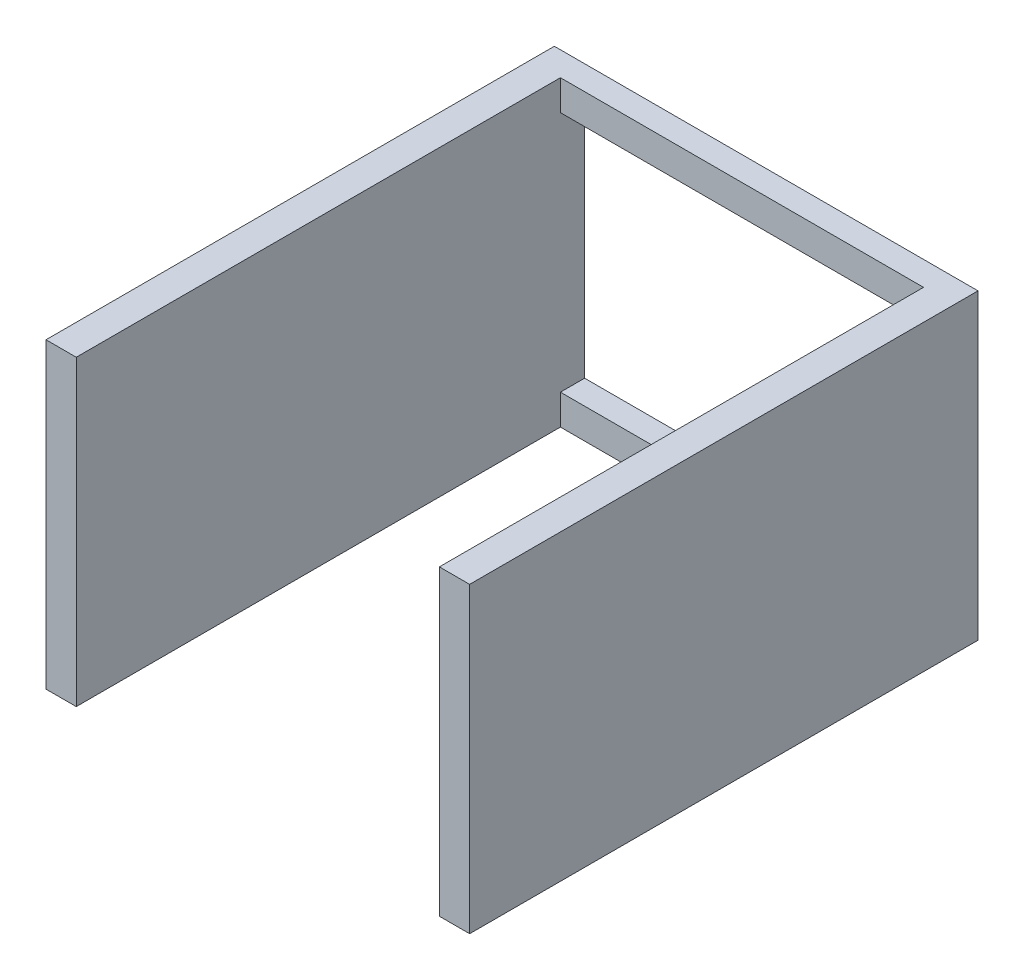
ISO-10303-21;
HEADER;
FILE_DESCRIPTION(('STEP AP214'),'2;1');
FILE_NAME('part.step','',(''),(''),'','','');
FILE_SCHEMA(('AUTOMOTIVE_DESIGN { 1 0 10303 214 1 1 1 1 }'));
ENDSEC;
DATA;
#1=APPLICATION_CONTEXT('core data for automotive mechanical design processes');
#2=APPLICATION_PROTOCOL_DEFINITION('international standard','automotive_design',2000,#1);
#3=PRODUCT_CONTEXT('',#1,'mechanical');
#4=PRODUCT('Part','Part','',(#3));
#5=PRODUCT_RELATED_PRODUCT_CATEGORY('part','',(#4));
#6=PRODUCT_DEFINITION_FORMATION('','',#4);
#7=PRODUCT_DEFINITION_CONTEXT('part definition',#1,'design');
#8=PRODUCT_DEFINITION('design','',#6,#7);
#9=PRODUCT_DEFINITION_SHAPE('','',#8);
#10=(LENGTH_UNIT() NAMED_UNIT(*) SI_UNIT(.MILLI.,.METRE.));
#11=(NAMED_UNIT(*) PLANE_ANGLE_UNIT() SI_UNIT($,.RADIAN.));
#12=(NAMED_UNIT(*) SI_UNIT($,.STERADIAN.) SOLID_ANGLE_UNIT());
#13=UNCERTAINTY_MEASURE_WITH_UNIT(LENGTH_MEASURE(1.E-05),#10,'distance_accuracy_value','');
#14=(GEOMETRIC_REPRESENTATION_CONTEXT(3) GLOBAL_UNCERTAINTY_ASSIGNED_CONTEXT((#13)) GLOBAL_UNIT_ASSIGNED_CONTEXT((#10,
#11,#12)) REPRESENTATION_CONTEXT('',''));
#15=CARTESIAN_POINT('',(0.,0.,0.));
#16=DIRECTION('',(0.,0.,1.));
#17=DIRECTION('',(1.,0.,0.));
#18=AXIS2_PLACEMENT_3D('',#15,#16,#17);
#19=CARTESIAN_POINT('',(0.,0.,42.));
#20=DIRECTION('',(0.,0.,-1.));
#21=DIRECTION('',(-1.,0.,0.));
#22=AXIS2_PLACEMENT_3D('',#19,#20,#21);
#23=PLANE('',#22);
#24=DIRECTION('',(1.,0.,0.));
#25=VECTOR('',#24,1.);
#26=CARTESIAN_POINT('',(0.,0.,42.));
#27=LINE('',#26,#25);
#28=CARTESIAN_POINT('',(0.,0.,42.));
#29=VERTEX_POINT('',#28);
#30=CARTESIAN_POINT('',(2.5,0.,42.));
#31=VERTEX_POINT('',#30);
#32=EDGE_CURVE('E151',#29,#31,#27,.T.);
#33=ORIENTED_EDGE('',*,*,#32,.T.);
#34=DIRECTION('',(0.,-1.,0.));
#35=VECTOR('',#34,1.);
#36=CARTESIAN_POINT('',(2.5,2.5,42.));
#37=LINE('',#36,#35);
#38=CARTESIAN_POINT('',(2.5,25.,42.));
#39=VERTEX_POINT('',#38);
#40=EDGE_CURVE('E132',#39,#31,#37,.T.);
#41=ORIENTED_EDGE('',*,*,#40,.F.);
#42=DIRECTION('',(-1.,0.,0.));
#43=VECTOR('',#42,1.);
#44=CARTESIAN_POINT('',(0.,25.,42.));
#45=LINE('',#44,#43);
#46=CARTESIAN_POINT('',(0.,25.,42.));
#47=VERTEX_POINT('',#46);
#48=EDGE_CURVE('E169',#39,#47,#45,.T.);
#49=ORIENTED_EDGE('',*,*,#48,.T.);
#50=DIRECTION('',(0.,-1.,0.));
#51=VECTOR('',#50,1.);
#52=CARTESIAN_POINT('',(0.,0.,42.));
#53=LINE('',#52,#51);
#54=EDGE_CURVE('E161',#47,#29,#53,.T.);
#55=ORIENTED_EDGE('',*,*,#54,.T.);
#56=EDGE_LOOP('',(#33,#41,#49,#55));
#57=FACE_BOUND('',#56,.T.);
#58=ADVANCED_FACE('F42',(#57),#23,.F.);
#59=CARTESIAN_POINT('',(0.,0.,42.));
#60=DIRECTION('',(1.,0.,0.));
#61=DIRECTION('',(0.,0.,-1.));
#62=AXIS2_PLACEMENT_3D('',#59,#60,#61);
#63=PLANE('',#62);
#64=DIRECTION('',(0.,-1.,0.));
#65=VECTOR('',#64,1.);
#66=CARTESIAN_POINT('',(0.,0.,0.));
#67=LINE('',#66,#65);
#68=CARTESIAN_POINT('',(0.,25.,0.));
#69=VERTEX_POINT('',#68);
#70=CARTESIAN_POINT('',(0.,0.,0.));
#71=VERTEX_POINT('',#70);
#72=EDGE_CURVE('E179',#69,#71,#67,.T.);
#73=ORIENTED_EDGE('',*,*,#72,.T.);
#74=DIRECTION('',(0.,0.,-1.));
#75=VECTOR('',#74,1.);
#76=CARTESIAN_POINT('',(0.,0.,42.));
#77=LINE('',#76,#75);
#78=EDGE_CURVE('E51',#29,#71,#77,.T.);
#79=ORIENTED_EDGE('',*,*,#78,.F.);
#80=ORIENTED_EDGE('',*,*,#54,.F.);
#81=DIRECTION('',(0.,0.,-1.));
#82=VECTOR('',#81,1.);
#83=CARTESIAN_POINT('',(0.,25.,42.));
#84=LINE('',#83,#82);
#85=EDGE_CURVE('E178',#47,#69,#84,.T.);
#86=ORIENTED_EDGE('',*,*,#85,.T.);
#87=EDGE_LOOP('',(#73,#79,#80,#86));
#88=FACE_BOUND('',#87,.T.);
#89=ADVANCED_FACE('F44',(#88),#63,.F.);
#90=CARTESIAN_POINT('',(0.,0.,42.));
#91=DIRECTION('',(0.,1.,0.));
#92=DIRECTION('',(0.,0.,1.));
#93=AXIS2_PLACEMENT_3D('',#90,#91,#92);
#94=PLANE('',#93);
#95=DIRECTION('',(-1.,0.,0.));
#96=VECTOR('',#95,1.);
#97=CARTESIAN_POINT('',(2.5,0.,2.));
#98=LINE('',#97,#96);
#99=CARTESIAN_POINT('',(32.5,0.,2.));
#100=VERTEX_POINT('',#99);
#101=CARTESIAN_POINT('',(2.5,0.,2.));
#102=VERTEX_POINT('',#101);
#103=EDGE_CURVE('E155',#100,#102,#98,.T.);
#104=ORIENTED_EDGE('',*,*,#103,.T.);
#105=DIRECTION('',(0.,0.,1.));
#106=VECTOR('',#105,1.);
#107=CARTESIAN_POINT('',(2.5,0.,42.));
#108=LINE('',#107,#106);
#109=EDGE_CURVE('E137',#102,#31,#108,.T.);
#110=ORIENTED_EDGE('',*,*,#109,.T.);
#111=ORIENTED_EDGE('',*,*,#32,.F.);
#112=ORIENTED_EDGE('',*,*,#78,.T.);
#113=DIRECTION('',(1.,0.,0.));
#114=VECTOR('',#113,1.);
#115=CARTESIAN_POINT('',(0.,0.,0.));
#116=LINE('',#115,#114);
#117=CARTESIAN_POINT('',(35.,0.,0.));
#118=VERTEX_POINT('',#117);
#119=EDGE_CURVE('E183',#71,#118,#116,.T.);
#120=ORIENTED_EDGE('',*,*,#119,.T.);
#121=DIRECTION('',(0.,0.,-1.));
#122=VECTOR('',#121,1.);
#123=CARTESIAN_POINT('',(35.,0.,42.));
#124=LINE('',#123,#122);
#125=CARTESIAN_POINT('',(35.,0.,42.));
#126=VERTEX_POINT('',#125);
#127=EDGE_CURVE('E200',#126,#118,#124,.T.);
#128=ORIENTED_EDGE('',*,*,#127,.F.);
#129=CARTESIAN_POINT('',(32.5,0.,42.));
#130=VERTEX_POINT('',#129);
#131=EDGE_CURVE('E165',#130,#126,#27,.T.);
#132=ORIENTED_EDGE('',*,*,#131,.F.);
#133=DIRECTION('',(0.,0.,-1.));
#134=VECTOR('',#133,1.);
#135=CARTESIAN_POINT('',(32.5,0.,42.));
#136=LINE('',#135,#134);
#137=EDGE_CURVE('E157',#130,#100,#136,.T.);
#138=ORIENTED_EDGE('',*,*,#137,.T.);
#139=EDGE_LOOP('',(#104,#110,#111,#112,#120,#128,#132,#138));
#140=FACE_BOUND('',#139,.T.);
#141=ADVANCED_FACE('F149',(#140),#94,.F.);
#142=CARTESIAN_POINT('',(35.,0.,42.));
#143=DIRECTION('',(-1.,0.,0.));
#144=DIRECTION('',(0.,0.,1.));
#145=AXIS2_PLACEMENT_3D('',#142,#143,#144);
#146=PLANE('',#145);
#147=DIRECTION('',(0.,1.,0.));
#148=VECTOR('',#147,1.);
#149=CARTESIAN_POINT('',(35.,0.,0.));
#150=LINE('',#149,#148);
#151=CARTESIAN_POINT('',(35.,25.,0.));
#152=VERTEX_POINT('',#151);
#153=EDGE_CURVE('E187',#118,#152,#150,.T.);
#154=ORIENTED_EDGE('',*,*,#153,.T.);
#155=DIRECTION('',(0.,0.,-1.));
#156=VECTOR('',#155,1.);
#157=CARTESIAN_POINT('',(35.,25.,42.));
#158=LINE('',#157,#156);
#159=CARTESIAN_POINT('',(35.,25.,42.));
#160=VERTEX_POINT('',#159);
#161=EDGE_CURVE('E196',#160,#152,#158,.T.);
#162=ORIENTED_EDGE('',*,*,#161,.F.);
#163=DIRECTION('',(0.,1.,0.));
#164=VECTOR('',#163,1.);
#165=CARTESIAN_POINT('',(35.,0.,42.));
#166=LINE('',#165,#164);
#167=EDGE_CURVE('E164',#126,#160,#166,.T.);
#168=ORIENTED_EDGE('',*,*,#167,.F.);
#169=ORIENTED_EDGE('',*,*,#127,.T.);
#170=EDGE_LOOP('',(#154,#162,#168,#169));
#171=FACE_BOUND('',#170,.T.);
#172=ADVANCED_FACE('F214',(#171),#146,.F.);
#173=CARTESIAN_POINT('',(0.,25.,42.));
#174=DIRECTION('',(0.,-1.,0.));
#175=DIRECTION('',(0.,0.,-1.));
#176=AXIS2_PLACEMENT_3D('',#173,#174,#175);
#177=PLANE('',#176);
#178=ORIENTED_EDGE('',*,*,#48,.F.);
#179=DIRECTION('',(0.,0.,1.));
#180=VECTOR('',#179,1.);
#181=CARTESIAN_POINT('',(2.5,25.,42.));
#182=LINE('',#181,#180);
#183=CARTESIAN_POINT('',(2.5,25.,2.));
#184=VERTEX_POINT('',#183);
#185=EDGE_CURVE('E140',#184,#39,#182,.T.);
#186=ORIENTED_EDGE('',*,*,#185,.F.);
#187=DIRECTION('',(-1.,0.,0.));
#188=VECTOR('',#187,1.);
#189=CARTESIAN_POINT('',(2.5,25.,2.));
#190=LINE('',#189,#188);
#191=CARTESIAN_POINT('',(32.5,25.,2.));
#192=VERTEX_POINT('',#191);
#193=EDGE_CURVE('E158',#192,#184,#190,.T.);
#194=ORIENTED_EDGE('',*,*,#193,.F.);
#195=DIRECTION('',(0.,0.,-1.));
#196=VECTOR('',#195,1.);
#197=CARTESIAN_POINT('',(32.5,25.,42.));
#198=LINE('',#197,#196);
#199=CARTESIAN_POINT('',(32.5,25.,42.));
#200=VERTEX_POINT('',#199);
#201=EDGE_CURVE('E221',#200,#192,#198,.T.);
#202=ORIENTED_EDGE('',*,*,#201,.F.);
#203=EDGE_CURVE('E174',#160,#200,#45,.T.);
#204=ORIENTED_EDGE('',*,*,#203,.F.);
#205=ORIENTED_EDGE('',*,*,#161,.T.);
#206=DIRECTION('',(-1.,0.,0.));
#207=VECTOR('',#206,1.);
#208=CARTESIAN_POINT('',(0.,25.,0.));
#209=LINE('',#208,#207);
#210=EDGE_CURVE('E190',#152,#69,#209,.T.);
#211=ORIENTED_EDGE('',*,*,#210,.T.);
#212=ORIENTED_EDGE('',*,*,#85,.F.);
#213=EDGE_LOOP('',(#178,#186,#194,#202,#204,#205,#211,#212));
#214=FACE_BOUND('',#213,.T.);
#215=ADVANCED_FACE('F218',(#214),#177,.F.);
#216=ORIENTED_EDGE('',*,*,#203,.T.);
#217=DIRECTION('',(0.,1.,0.));
#218=VECTOR('',#217,1.);
#219=CARTESIAN_POINT('',(32.5,2.5,42.));
#220=LINE('',#219,#218);
#221=EDGE_CURVE('E145',#130,#200,#220,.T.);
#222=ORIENTED_EDGE('',*,*,#221,.F.);
#223=ORIENTED_EDGE('',*,*,#131,.T.);
#224=ORIENTED_EDGE('',*,*,#167,.T.);
#225=EDGE_LOOP('',(#216,#222,#223,#224));
#226=FACE_BOUND('',#225,.T.);
#227=ADVANCED_FACE('F223',(#226),#23,.F.);
#228=CARTESIAN_POINT('',(0.,0.,0.));
#229=DIRECTION('',(0.,0.,-1.));
#230=DIRECTION('',(-1.,0.,0.));
#231=AXIS2_PLACEMENT_3D('',#228,#229,#230);
#232=PLANE('',#231);
#233=DIRECTION('',(0.,-1.,0.));
#234=VECTOR('',#233,1.);
#235=CARTESIAN_POINT('',(2.5,2.5,0.));
#236=LINE('',#235,#234);
#237=CARTESIAN_POINT('',(2.5,22.5,0.));
#238=VERTEX_POINT('',#237);
#239=CARTESIAN_POINT('',(2.5,2.5,0.));
#240=VERTEX_POINT('',#239);
#241=EDGE_CURVE('E248',#238,#240,#236,.T.);
#242=ORIENTED_EDGE('',*,*,#241,.T.);
#243=DIRECTION('',(1.,0.,0.));
#244=VECTOR('',#243,1.);
#245=CARTESIAN_POINT('',(2.5,2.5,0.));
#246=LINE('',#245,#244);
#247=CARTESIAN_POINT('',(32.5,2.5,0.));
#248=VERTEX_POINT('',#247);
#249=EDGE_CURVE('E252',#240,#248,#246,.T.);
#250=ORIENTED_EDGE('',*,*,#249,.T.);
#251=DIRECTION('',(0.,1.,0.));
#252=VECTOR('',#251,1.);
#253=CARTESIAN_POINT('',(32.5,2.5,0.));
#254=LINE('',#253,#252);
#255=CARTESIAN_POINT('',(32.5,22.5,0.));
#256=VERTEX_POINT('',#255);
#257=EDGE_CURVE('E64',#248,#256,#254,.T.);
#258=ORIENTED_EDGE('',*,*,#257,.T.);
#259=DIRECTION('',(-1.,0.,0.));
#260=VECTOR('',#259,1.);
#261=CARTESIAN_POINT('',(2.5,22.5,0.));
#262=LINE('',#261,#260);
#263=EDGE_CURVE('E258',#256,#238,#262,.T.);
#264=ORIENTED_EDGE('',*,*,#263,.T.);
#265=EDGE_LOOP('',(#242,#250,#258,#264));
#266=FACE_BOUND('',#265,.T.);
#267=ORIENTED_EDGE('',*,*,#72,.F.);
#268=ORIENTED_EDGE('',*,*,#210,.F.);
#269=ORIENTED_EDGE('',*,*,#153,.F.);
#270=ORIENTED_EDGE('',*,*,#119,.F.);
#271=EDGE_LOOP('',(#267,#268,#269,#270));
#272=FACE_BOUND('',#271,.T.);
#273=ADVANCED_FACE('F210',(#266,#272),#232,.T.);
#274=CARTESIAN_POINT('',(2.5,2.5,0.));
#275=DIRECTION('',(-1.,0.,0.));
#276=DIRECTION('',(0.,0.,1.));
#277=AXIS2_PLACEMENT_3D('',#274,#275,#276);
#278=PLANE('',#277);
#279=DIRECTION('',(0.,0.,1.));
#280=VECTOR('',#279,1.);
#281=CARTESIAN_POINT('',(2.5,22.5,0.));
#282=LINE('',#281,#280);
#283=CARTESIAN_POINT('',(2.5,22.5,2.));
#284=VERTEX_POINT('',#283);
#285=EDGE_CURVE('E184',#238,#284,#282,.T.);
#286=ORIENTED_EDGE('',*,*,#285,.T.);
#287=DIRECTION('',(0.,1.,0.));
#288=VECTOR('',#287,1.);
#289=CARTESIAN_POINT('',(2.5,0.,2.));
#290=LINE('',#289,#288);
#291=EDGE_CURVE('E241',#284,#184,#290,.T.);
#292=ORIENTED_EDGE('',*,*,#291,.T.);
#293=ORIENTED_EDGE('',*,*,#185,.T.);
#294=ORIENTED_EDGE('',*,*,#40,.T.);
#295=ORIENTED_EDGE('',*,*,#109,.F.);
#296=CARTESIAN_POINT('',(2.5,2.5,2.));
#297=VERTEX_POINT('',#296);
#298=EDGE_CURVE('E238',#102,#297,#290,.T.);
#299=ORIENTED_EDGE('',*,*,#298,.T.);
#300=DIRECTION('',(0.,0.,1.));
#301=VECTOR('',#300,1.);
#302=CARTESIAN_POINT('',(2.5,2.5,0.));
#303=LINE('',#302,#301);
#304=EDGE_CURVE('E261',#240,#297,#303,.T.);
#305=ORIENTED_EDGE('',*,*,#304,.F.);
#306=ORIENTED_EDGE('',*,*,#241,.F.);
#307=EDGE_LOOP('',(#286,#292,#293,#294,#295,#299,#305,#306));
#308=FACE_BOUND('',#307,.T.);
#309=ADVANCED_FACE('F135',(#308),#278,.F.);
#310=CARTESIAN_POINT('',(2.5,22.5,0.));
#311=DIRECTION('',(0.,1.,0.));
#312=DIRECTION('',(0.,0.,1.));
#313=AXIS2_PLACEMENT_3D('',#310,#311,#312);
#314=PLANE('',#313);
#315=DIRECTION('',(0.,0.,1.));
#316=VECTOR('',#315,1.);
#317=CARTESIAN_POINT('',(32.5,22.5,0.));
#318=LINE('',#317,#316);
#319=CARTESIAN_POINT('',(32.5,22.5,2.));
#320=VERTEX_POINT('',#319);
#321=EDGE_CURVE('E267',#256,#320,#318,.T.);
#322=ORIENTED_EDGE('',*,*,#321,.T.);
#323=DIRECTION('',(-1.,0.,0.));
#324=VECTOR('',#323,1.);
#325=CARTESIAN_POINT('',(2.5,22.5,2.));
#326=LINE('',#325,#324);
#327=EDGE_CURVE('E146',#320,#284,#326,.T.);
#328=ORIENTED_EDGE('',*,*,#327,.T.);
#329=ORIENTED_EDGE('',*,*,#285,.F.);
#330=ORIENTED_EDGE('',*,*,#263,.F.);
#331=EDGE_LOOP('',(#322,#328,#329,#330));
#332=FACE_BOUND('',#331,.T.);
#333=ADVANCED_FACE('F285',(#332),#314,.F.);
#334=CARTESIAN_POINT('',(32.5,2.5,0.));
#335=DIRECTION('',(1.,0.,0.));
#336=DIRECTION('',(0.,0.,-1.));
#337=AXIS2_PLACEMENT_3D('',#334,#335,#336);
#338=PLANE('',#337);
#339=DIRECTION('',(0.,0.,1.));
#340=VECTOR('',#339,1.);
#341=CARTESIAN_POINT('',(32.5,2.5,0.));
#342=LINE('',#341,#340);
#343=CARTESIAN_POINT('',(32.5,2.5,2.));
#344=VERTEX_POINT('',#343);
#345=EDGE_CURVE('E271',#248,#344,#342,.T.);
#346=ORIENTED_EDGE('',*,*,#345,.T.);
#347=DIRECTION('',(0.,1.,0.));
#348=VECTOR('',#347,1.);
#349=CARTESIAN_POINT('',(32.5,0.,2.));
#350=LINE('',#349,#348);
#351=EDGE_CURVE('E242',#100,#344,#350,.T.);
#352=ORIENTED_EDGE('',*,*,#351,.F.);
#353=ORIENTED_EDGE('',*,*,#137,.F.);
#354=ORIENTED_EDGE('',*,*,#221,.T.);
#355=ORIENTED_EDGE('',*,*,#201,.T.);
#356=EDGE_CURVE('E58',#320,#192,#350,.T.);
#357=ORIENTED_EDGE('',*,*,#356,.F.);
#358=ORIENTED_EDGE('',*,*,#321,.F.);
#359=ORIENTED_EDGE('',*,*,#257,.F.);
#360=EDGE_LOOP('',(#346,#352,#353,#354,#355,#357,#358,#359));
#361=FACE_BOUND('',#360,.T.);
#362=ADVANCED_FACE('F281',(#361),#338,.F.);
#363=CARTESIAN_POINT('',(2.5,2.5,0.));
#364=DIRECTION('',(0.,-1.,0.));
#365=DIRECTION('',(0.,0.,-1.));
#366=AXIS2_PLACEMENT_3D('',#363,#364,#365);
#367=PLANE('',#366);
#368=ORIENTED_EDGE('',*,*,#304,.T.);
#369=DIRECTION('',(1.,0.,0.));
#370=VECTOR('',#369,1.);
#371=CARTESIAN_POINT('',(2.5,2.5,2.));
#372=LINE('',#371,#370);
#373=EDGE_CURVE('E11',#297,#344,#372,.T.);
#374=ORIENTED_EDGE('',*,*,#373,.T.);
#375=ORIENTED_EDGE('',*,*,#345,.F.);
#376=ORIENTED_EDGE('',*,*,#249,.F.);
#377=EDGE_LOOP('',(#368,#374,#375,#376));
#378=FACE_BOUND('',#377,.T.);
#379=ADVANCED_FACE('F277',(#378),#367,.F.);
#380=CARTESIAN_POINT('',(2.5,0.,2.));
#381=DIRECTION('',(0.,0.,-1.));
#382=DIRECTION('',(-1.,0.,0.));
#383=AXIS2_PLACEMENT_3D('',#380,#381,#382);
#384=PLANE('',#383);
#385=ORIENTED_EDGE('',*,*,#298,.F.);
#386=ORIENTED_EDGE('',*,*,#103,.F.);
#387=ORIENTED_EDGE('',*,*,#351,.T.);
#388=ORIENTED_EDGE('',*,*,#373,.F.);
#389=EDGE_LOOP('',(#385,#386,#387,#388));
#390=FACE_BOUND('',#389,.T.);
#391=ADVANCED_FACE('F280',(#390),#384,.F.);
#392=ORIENTED_EDGE('',*,*,#356,.T.);
#393=ORIENTED_EDGE('',*,*,#193,.T.);
#394=ORIENTED_EDGE('',*,*,#291,.F.);
#395=ORIENTED_EDGE('',*,*,#327,.F.);
#396=EDGE_LOOP('',(#392,#393,#394,#395));
#397=FACE_BOUND('',#396,.T.);
#398=ADVANCED_FACE('F288',(#397),#384,.F.);
#399=CLOSED_SHELL('',(#58,#89,#141,#172,#215,#227,#273,#309,#333,#362,#379,#391,#398));
#400=MANIFOLD_SOLID_BREP('B2',#399);
#401=ADVANCED_BREP_SHAPE_REPRESENTATION('',(#18,#400),#14);
#402=SHAPE_DEFINITION_REPRESENTATION(#9,#401);
ENDSEC;
END-ISO-10303-21;
